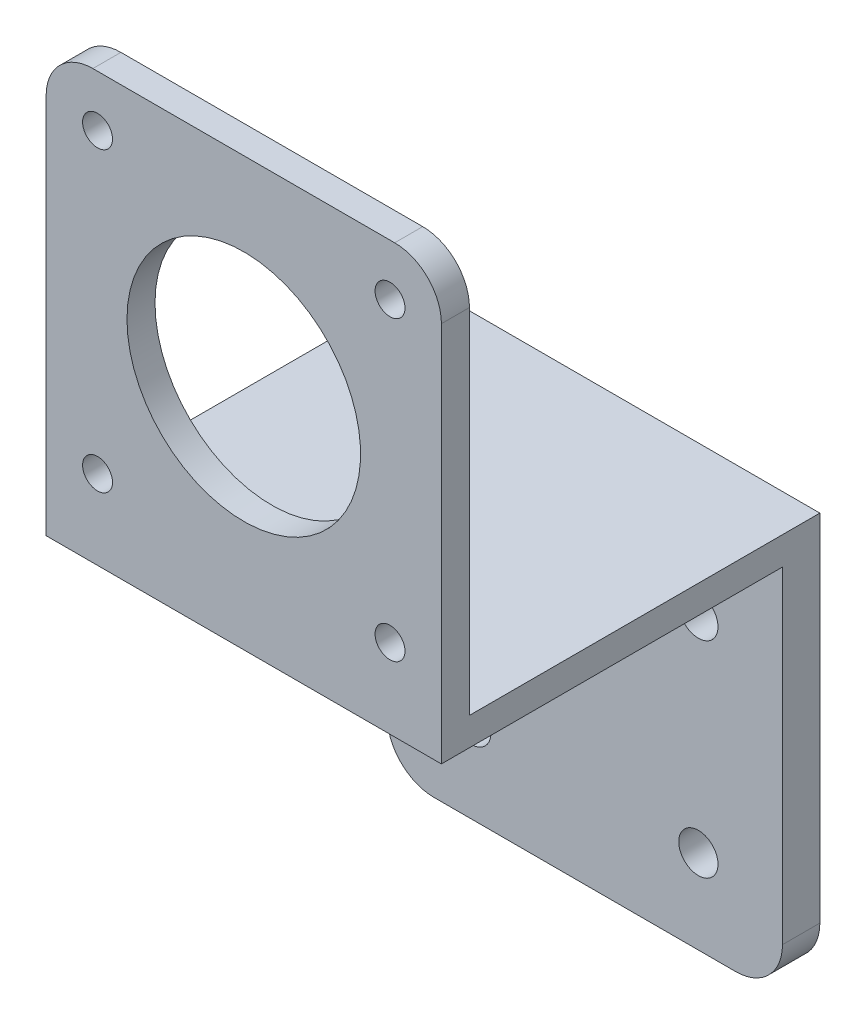
ISO-10303-21;
HEADER;
FILE_DESCRIPTION(('STEP AP214'),'2;1');
FILE_NAME('part.step','',(''),(''),'','','');
FILE_SCHEMA(('AUTOMOTIVE_DESIGN { 1 0 10303 214 1 1 1 1 }'));
ENDSEC;
DATA;
#1=APPLICATION_CONTEXT('core data for automotive mechanical design processes');
#2=APPLICATION_PROTOCOL_DEFINITION('international standard','automotive_design',2000,#1);
#3=PRODUCT_CONTEXT('',#1,'mechanical');
#4=PRODUCT('Part','Part','',(#3));
#5=PRODUCT_RELATED_PRODUCT_CATEGORY('part','',(#4));
#6=PRODUCT_DEFINITION_FORMATION('','',#4);
#7=PRODUCT_DEFINITION_CONTEXT('part definition',#1,'design');
#8=PRODUCT_DEFINITION('design','',#6,#7);
#9=PRODUCT_DEFINITION_SHAPE('','',#8);
#10=(LENGTH_UNIT() NAMED_UNIT(*) SI_UNIT(.MILLI.,.METRE.));
#11=(NAMED_UNIT(*) PLANE_ANGLE_UNIT() SI_UNIT($,.RADIAN.));
#12=(NAMED_UNIT(*) SI_UNIT($,.STERADIAN.) SOLID_ANGLE_UNIT());
#13=UNCERTAINTY_MEASURE_WITH_UNIT(LENGTH_MEASURE(1.E-05),#10,'distance_accuracy_value','');
#14=(GEOMETRIC_REPRESENTATION_CONTEXT(3) GLOBAL_UNCERTAINTY_ASSIGNED_CONTEXT((#13)) GLOBAL_UNIT_ASSIGNED_CONTEXT((#10,
#11,#12)) REPRESENTATION_CONTEXT('',''));
#15=CARTESIAN_POINT('',(0.,0.,0.));
#16=DIRECTION('',(0.,0.,1.));
#17=DIRECTION('',(1.,0.,0.));
#18=AXIS2_PLACEMENT_3D('',#15,#16,#17);
#19=CARTESIAN_POINT('',(21.15,21.4,3.));
#20=DIRECTION('',(-1.,0.,0.));
#21=DIRECTION('',(0.,-1.,0.));
#22=AXIS2_PLACEMENT_3D('',#19,#20,#21);
#23=PLANE('',#22);
#24=DIRECTION('',(0.,1.,0.));
#25=VECTOR('',#24,1.);
#26=CARTESIAN_POINT('',(21.15,21.4,0.));
#27=LINE('',#26,#25);
#28=CARTESIAN_POINT('',(21.15,-21.4,0.));
#29=VERTEX_POINT('',#28);
#30=CARTESIAN_POINT('',(21.15,16.4,0.));
#31=VERTEX_POINT('',#30);
#32=EDGE_CURVE('E236',#29,#31,#27,.T.);
#33=ORIENTED_EDGE('',*,*,#32,.T.);
#34=DIRECTION('',(0.,0.,-1.));
#35=VECTOR('',#34,1.);
#36=CARTESIAN_POINT('',(21.15,16.4,3.));
#37=LINE('',#36,#35);
#38=CARTESIAN_POINT('',(21.15,16.4,3.));
#39=VERTEX_POINT('',#38);
#40=EDGE_CURVE('E293',#31,#39,#37,.F.);
#41=ORIENTED_EDGE('',*,*,#40,.T.);
#42=DIRECTION('',(0.,1.,0.));
#43=VECTOR('',#42,1.);
#44=CARTESIAN_POINT('',(21.15,21.4,3.));
#45=LINE('',#44,#43);
#46=CARTESIAN_POINT('',(21.15,-24.4,3.));
#47=VERTEX_POINT('',#46);
#48=EDGE_CURVE('E240',#47,#39,#45,.T.);
#49=ORIENTED_EDGE('',*,*,#48,.F.);
#50=DIRECTION('',(0.,0.,1.));
#51=VECTOR('',#50,1.);
#52=CARTESIAN_POINT('',(21.15,-24.4,3.));
#53=LINE('',#52,#51);
#54=CARTESIAN_POINT('',(21.15,-24.4,-33.5));
#55=VERTEX_POINT('',#54);
#56=EDGE_CURVE('E158',#55,#47,#53,.T.);
#57=ORIENTED_EDGE('',*,*,#56,.F.);
#58=DIRECTION('',(0.,1.,0.));
#59=VECTOR('',#58,1.);
#60=CARTESIAN_POINT('',(21.15,-64.4,-33.5));
#61=LINE('',#60,#59);
#62=CARTESIAN_POINT('',(21.15,-59.4,-33.5));
#63=VERTEX_POINT('',#62);
#64=EDGE_CURVE('E146',#63,#55,#61,.T.);
#65=ORIENTED_EDGE('',*,*,#64,.F.);
#66=DIRECTION('',(0.,0.,1.));
#67=VECTOR('',#66,1.);
#68=CARTESIAN_POINT('',(21.15,-59.4,3.));
#69=LINE('',#68,#67);
#70=CARTESIAN_POINT('',(21.15,-59.4,-37.5));
#71=VERTEX_POINT('',#70);
#72=EDGE_CURVE('E290',#63,#71,#69,.F.);
#73=ORIENTED_EDGE('',*,*,#72,.T.);
#74=DIRECTION('',(0.,1.,0.));
#75=VECTOR('',#74,1.);
#76=CARTESIAN_POINT('',(21.15,-24.4,-37.5));
#77=LINE('',#76,#75);
#78=CARTESIAN_POINT('',(21.15,-21.4,-37.5));
#79=VERTEX_POINT('',#78);
#80=EDGE_CURVE('E183',#71,#79,#77,.T.);
#81=ORIENTED_EDGE('',*,*,#80,.T.);
#82=DIRECTION('',(0.,0.,1.));
#83=VECTOR('',#82,1.);
#84=CARTESIAN_POINT('',(21.15,-21.4,3.));
#85=LINE('',#84,#83);
#86=EDGE_CURVE('E159',#79,#29,#85,.T.);
#87=ORIENTED_EDGE('',*,*,#86,.T.);
#88=EDGE_LOOP('',(#33,#41,#49,#57,#65,#73,#81,#87));
#89=FACE_BOUND('',#88,.T.);
#90=ADVANCED_FACE('F45',(#89),#23,.F.);
#91=CARTESIAN_POINT('',(-21.15,21.4,3.));
#92=DIRECTION('',(0.,-1.,0.));
#93=DIRECTION('',(0.,0.,-1.));
#94=AXIS2_PLACEMENT_3D('',#91,#92,#93);
#95=PLANE('',#94);
#96=DIRECTION('',(-1.,0.,0.));
#97=VECTOR('',#96,1.);
#98=CARTESIAN_POINT('',(-21.15,21.4,0.));
#99=LINE('',#98,#97);
#100=CARTESIAN_POINT('',(16.15,21.4,0.));
#101=VERTEX_POINT('',#100);
#102=CARTESIAN_POINT('',(-16.15,21.4,0.));
#103=VERTEX_POINT('',#102);
#104=EDGE_CURVE('E255',#101,#103,#99,.T.);
#105=ORIENTED_EDGE('',*,*,#104,.T.);
#106=DIRECTION('',(0.,0.,-1.));
#107=VECTOR('',#106,1.);
#108=CARTESIAN_POINT('',(-16.15,21.4,3.));
#109=LINE('',#108,#107);
#110=CARTESIAN_POINT('',(-16.15,21.4,3.));
#111=VERTEX_POINT('',#110);
#112=EDGE_CURVE('E281',#103,#111,#109,.F.);
#113=ORIENTED_EDGE('',*,*,#112,.T.);
#114=DIRECTION('',(-1.,0.,0.));
#115=VECTOR('',#114,1.);
#116=CARTESIAN_POINT('',(-21.15,21.4,3.));
#117=LINE('',#116,#115);
#118=CARTESIAN_POINT('',(16.15,21.4,3.));
#119=VERTEX_POINT('',#118);
#120=EDGE_CURVE('E244',#119,#111,#117,.T.);
#121=ORIENTED_EDGE('',*,*,#120,.F.);
#122=DIRECTION('',(0.,0.,-1.));
#123=VECTOR('',#122,1.);
#124=CARTESIAN_POINT('',(16.15,21.4,3.));
#125=LINE('',#124,#123);
#126=EDGE_CURVE('E277',#119,#101,#125,.T.);
#127=ORIENTED_EDGE('',*,*,#126,.T.);
#128=EDGE_LOOP('',(#105,#113,#121,#127));
#129=FACE_BOUND('',#128,.T.);
#130=ADVANCED_FACE('F337',(#129),#95,.F.);
#131=CARTESIAN_POINT('',(-21.15,21.4,3.));
#132=DIRECTION('',(1.,0.,0.));
#133=DIRECTION('',(0.,1.,0.));
#134=AXIS2_PLACEMENT_3D('',#131,#132,#133);
#135=PLANE('',#134);
#136=DIRECTION('',(0.,-1.,0.));
#137=VECTOR('',#136,1.);
#138=CARTESIAN_POINT('',(-21.15,21.4,3.));
#139=LINE('',#138,#137);
#140=CARTESIAN_POINT('',(-21.15,16.4,3.));
#141=VERTEX_POINT('',#140);
#142=CARTESIAN_POINT('',(-21.15,-24.4,3.));
#143=VERTEX_POINT('',#142);
#144=EDGE_CURVE('E249',#141,#143,#139,.T.);
#145=ORIENTED_EDGE('',*,*,#144,.F.);
#146=DIRECTION('',(0.,0.,-1.));
#147=VECTOR('',#146,1.);
#148=CARTESIAN_POINT('',(-21.15,16.4,3.));
#149=LINE('',#148,#147);
#150=CARTESIAN_POINT('',(-21.15,16.4,0.));
#151=VERTEX_POINT('',#150);
#152=EDGE_CURVE('E267',#141,#151,#149,.T.);
#153=ORIENTED_EDGE('',*,*,#152,.T.);
#154=DIRECTION('',(0.,-1.,0.));
#155=VECTOR('',#154,1.);
#156=CARTESIAN_POINT('',(-21.15,21.4,0.));
#157=LINE('',#156,#155);
#158=CARTESIAN_POINT('',(-21.15,-21.4,0.));
#159=VERTEX_POINT('',#158);
#160=EDGE_CURVE('E259',#151,#159,#157,.T.);
#161=ORIENTED_EDGE('',*,*,#160,.T.);
#162=DIRECTION('',(0.,0.,-1.));
#163=VECTOR('',#162,1.);
#164=CARTESIAN_POINT('',(-21.15,-21.4,3.));
#165=LINE('',#164,#163);
#166=CARTESIAN_POINT('',(-21.15,-21.4,-37.5));
#167=VERTEX_POINT('',#166);
#168=EDGE_CURVE('E177',#159,#167,#165,.T.);
#169=ORIENTED_EDGE('',*,*,#168,.T.);
#170=DIRECTION('',(0.,1.,0.));
#171=VECTOR('',#170,1.);
#172=CARTESIAN_POINT('',(-21.15,-24.4,-37.5));
#173=LINE('',#172,#171);
#174=CARTESIAN_POINT('',(-21.15,-59.4,-37.5));
#175=VERTEX_POINT('',#174);
#176=EDGE_CURVE('E196',#175,#167,#173,.T.);
#177=ORIENTED_EDGE('',*,*,#176,.F.);
#178=DIRECTION('',(0.,0.,-1.));
#179=VECTOR('',#178,1.);
#180=CARTESIAN_POINT('',(-21.15,-59.4,3.));
#181=LINE('',#180,#179);
#182=CARTESIAN_POINT('',(-21.15,-59.4,-33.5));
#183=VERTEX_POINT('',#182);
#184=EDGE_CURVE('E143',#175,#183,#181,.F.);
#185=ORIENTED_EDGE('',*,*,#184,.T.);
#186=DIRECTION('',(0.,1.,0.));
#187=VECTOR('',#186,1.);
#188=CARTESIAN_POINT('',(-21.15,-64.4,-33.5));
#189=LINE('',#188,#187);
#190=CARTESIAN_POINT('',(-21.15,-24.4,-33.5));
#191=VERTEX_POINT('',#190);
#192=EDGE_CURVE('E136',#183,#191,#189,.T.);
#193=ORIENTED_EDGE('',*,*,#192,.T.);
#194=DIRECTION('',(0.,0.,-1.));
#195=VECTOR('',#194,1.);
#196=CARTESIAN_POINT('',(-21.15,-24.4,3.));
#197=LINE('',#196,#195);
#198=EDGE_CURVE('E140',#143,#191,#197,.T.);
#199=ORIENTED_EDGE('',*,*,#198,.F.);
#200=EDGE_LOOP('',(#145,#153,#161,#169,#177,#185,#193,#199));
#201=FACE_BOUND('',#200,.T.);
#202=ADVANCED_FACE('F139',(#201),#135,.F.);
#203=CARTESIAN_POINT('',(0.,0.,3.));
#204=DIRECTION('',(0.,0.,1.));
#205=DIRECTION('',(1.,0.,0.));
#206=AXIS2_PLACEMENT_3D('',#203,#204,#205);
#207=PLANE('',#206);
#208=CARTESIAN_POINT('',(-15.65,-15.9,3.));
#209=DIRECTION('',(0.,0.,-1.));
#210=DIRECTION('',(-1.,0.,0.));
#211=AXIS2_PLACEMENT_3D('',#208,#209,#210);
#212=CIRCLE('',#211,1.6);
#213=CARTESIAN_POINT('',(-17.25,-15.9,3.));
#214=VERTEX_POINT('',#213);
#215=EDGE_CURVE('E199',#214,#214,#212,.T.);
#216=ORIENTED_EDGE('',*,*,#215,.T.);
#217=EDGE_LOOP('',(#216));
#218=FACE_BOUND('',#217,.T.);
#219=CARTESIAN_POINT('',(15.65,-15.9,3.));
#220=DIRECTION('',(0.,0.,-1.));
#221=DIRECTION('',(-1.,0.,0.));
#222=AXIS2_PLACEMENT_3D('',#219,#220,#221);
#223=CIRCLE('',#222,1.6);
#224=CARTESIAN_POINT('',(14.05,-15.9,3.));
#225=VERTEX_POINT('',#224);
#226=EDGE_CURVE('E221',#225,#225,#223,.T.);
#227=ORIENTED_EDGE('',*,*,#226,.T.);
#228=EDGE_LOOP('',(#227));
#229=FACE_BOUND('',#228,.T.);
#230=CARTESIAN_POINT('',(-15.65,15.9,3.));
#231=DIRECTION('',(0.,0.,-1.));
#232=DIRECTION('',(-1.,0.,0.));
#233=AXIS2_PLACEMENT_3D('',#230,#231,#232);
#234=CIRCLE('',#233,1.6);
#235=CARTESIAN_POINT('',(-17.25,15.9,3.));
#236=VERTEX_POINT('',#235);
#237=EDGE_CURVE('E213',#236,#236,#234,.T.);
#238=ORIENTED_EDGE('',*,*,#237,.T.);
#239=EDGE_LOOP('',(#238));
#240=FACE_BOUND('',#239,.T.);
#241=CARTESIAN_POINT('',(15.65,15.9,3.));
#242=DIRECTION('',(0.,0.,-1.));
#243=DIRECTION('',(-1.,0.,0.));
#244=AXIS2_PLACEMENT_3D('',#241,#242,#243);
#245=CIRCLE('',#244,1.6);
#246=CARTESIAN_POINT('',(14.05,15.9,3.));
#247=VERTEX_POINT('',#246);
#248=EDGE_CURVE('E205',#247,#247,#245,.T.);
#249=ORIENTED_EDGE('',*,*,#248,.T.);
#250=EDGE_LOOP('',(#249));
#251=FACE_BOUND('',#250,.T.);
#252=CARTESIAN_POINT('',(0.,0.,3.));
#253=DIRECTION('',(0.,0.,-1.));
#254=DIRECTION('',(-1.,0.,0.));
#255=AXIS2_PLACEMENT_3D('',#252,#253,#254);
#256=CIRCLE('',#255,12.5);
#257=CARTESIAN_POINT('',(-12.5,0.,3.));
#258=VERTEX_POINT('',#257);
#259=EDGE_CURVE('E232',#258,#258,#256,.T.);
#260=ORIENTED_EDGE('',*,*,#259,.T.);
#261=EDGE_LOOP('',(#260));
#262=FACE_BOUND('',#261,.T.);
#263=ORIENTED_EDGE('',*,*,#120,.T.);
#264=CARTESIAN_POINT('',(-16.15,16.4,3.));
#265=DIRECTION('',(0.,0.,1.));
#266=DIRECTION('',(1.,0.,0.));
#267=AXIS2_PLACEMENT_3D('',#264,#265,#266);
#268=CIRCLE('',#267,5.);
#269=EDGE_CURVE('E287',#111,#141,#268,.T.);
#270=ORIENTED_EDGE('',*,*,#269,.T.);
#271=ORIENTED_EDGE('',*,*,#144,.T.);
#272=DIRECTION('',(-1.,0.,0.));
#273=VECTOR('',#272,1.);
#274=CARTESIAN_POINT('',(-21.15,-24.4,3.));
#275=LINE('',#274,#273);
#276=EDGE_CURVE('E156',#47,#143,#275,.T.);
#277=ORIENTED_EDGE('',*,*,#276,.F.);
#278=ORIENTED_EDGE('',*,*,#48,.T.);
#279=CARTESIAN_POINT('',(16.15,16.4,3.));
#280=DIRECTION('',(0.,0.,1.));
#281=DIRECTION('',(1.,0.,0.));
#282=AXIS2_PLACEMENT_3D('',#279,#280,#281);
#283=CIRCLE('',#282,5.);
#284=EDGE_CURVE('E284',#39,#119,#283,.T.);
#285=ORIENTED_EDGE('',*,*,#284,.T.);
#286=EDGE_LOOP('',(#263,#270,#271,#277,#278,#285));
#287=FACE_BOUND('',#286,.T.);
#288=ADVANCED_FACE('F341',(#218,#229,#240,#251,#262,#287),#207,.T.);
#289=CARTESIAN_POINT('',(0.,0.,0.));
#290=DIRECTION('',(0.,0.,1.));
#291=DIRECTION('',(1.,0.,0.));
#292=AXIS2_PLACEMENT_3D('',#289,#290,#291);
#293=PLANE('',#292);
#294=CARTESIAN_POINT('',(-15.65,-15.9,0.));
#295=DIRECTION('',(0.,0.,-1.));
#296=DIRECTION('',(-1.,0.,0.));
#297=AXIS2_PLACEMENT_3D('',#294,#295,#296);
#298=CIRCLE('',#297,1.6);
#299=CARTESIAN_POINT('',(-17.25,-15.9,0.));
#300=VERTEX_POINT('',#299);
#301=EDGE_CURVE('E225',#300,#300,#298,.T.);
#302=ORIENTED_EDGE('',*,*,#301,.F.);
#303=EDGE_LOOP('',(#302));
#304=FACE_BOUND('',#303,.T.);
#305=CARTESIAN_POINT('',(15.65,-15.9,0.));
#306=DIRECTION('',(0.,0.,-1.));
#307=DIRECTION('',(-1.,0.,0.));
#308=AXIS2_PLACEMENT_3D('',#305,#306,#307);
#309=CIRCLE('',#308,1.6);
#310=CARTESIAN_POINT('',(14.05,-15.9,0.));
#311=VERTEX_POINT('',#310);
#312=EDGE_CURVE('E217',#311,#311,#309,.T.);
#313=ORIENTED_EDGE('',*,*,#312,.F.);
#314=EDGE_LOOP('',(#313));
#315=FACE_BOUND('',#314,.T.);
#316=CARTESIAN_POINT('',(-15.65,15.9,0.));
#317=DIRECTION('',(0.,0.,-1.));
#318=DIRECTION('',(-1.,0.,0.));
#319=AXIS2_PLACEMENT_3D('',#316,#317,#318);
#320=CIRCLE('',#319,1.6);
#321=CARTESIAN_POINT('',(-17.25,15.9,0.));
#322=VERTEX_POINT('',#321);
#323=EDGE_CURVE('E209',#322,#322,#320,.T.);
#324=ORIENTED_EDGE('',*,*,#323,.F.);
#325=EDGE_LOOP('',(#324));
#326=FACE_BOUND('',#325,.T.);
#327=CARTESIAN_POINT('',(15.65,15.9,0.));
#328=DIRECTION('',(0.,0.,-1.));
#329=DIRECTION('',(-1.,0.,0.));
#330=AXIS2_PLACEMENT_3D('',#327,#328,#329);
#331=CIRCLE('',#330,1.6);
#332=CARTESIAN_POINT('',(14.05,15.9,0.));
#333=VERTEX_POINT('',#332);
#334=EDGE_CURVE('E200',#333,#333,#331,.T.);
#335=ORIENTED_EDGE('',*,*,#334,.F.);
#336=EDGE_LOOP('',(#335));
#337=FACE_BOUND('',#336,.T.);
#338=CARTESIAN_POINT('',(0.,0.,0.));
#339=DIRECTION('',(0.,0.,-1.));
#340=DIRECTION('',(-1.,0.,0.));
#341=AXIS2_PLACEMENT_3D('',#338,#339,#340);
#342=CIRCLE('',#341,12.5);
#343=CARTESIAN_POINT('',(-12.5,0.,0.));
#344=VERTEX_POINT('',#343);
#345=EDGE_CURVE('E204',#344,#344,#342,.T.);
#346=ORIENTED_EDGE('',*,*,#345,.F.);
#347=EDGE_LOOP('',(#346));
#348=FACE_BOUND('',#347,.T.);
#349=ORIENTED_EDGE('',*,*,#160,.F.);
#350=CARTESIAN_POINT('',(-16.15,16.4,0.));
#351=DIRECTION('',(0.,0.,1.));
#352=DIRECTION('',(1.,0.,0.));
#353=AXIS2_PLACEMENT_3D('',#350,#351,#352);
#354=CIRCLE('',#353,5.);
#355=EDGE_CURVE('E274',#151,#103,#354,.F.);
#356=ORIENTED_EDGE('',*,*,#355,.T.);
#357=ORIENTED_EDGE('',*,*,#104,.F.);
#358=CARTESIAN_POINT('',(16.15,16.4,0.));
#359=DIRECTION('',(0.,0.,1.));
#360=DIRECTION('',(1.,0.,0.));
#361=AXIS2_PLACEMENT_3D('',#358,#359,#360);
#362=CIRCLE('',#361,5.);
#363=EDGE_CURVE('E271',#101,#31,#362,.F.);
#364=ORIENTED_EDGE('',*,*,#363,.T.);
#365=ORIENTED_EDGE('',*,*,#32,.F.);
#366=DIRECTION('',(1.,0.,0.));
#367=VECTOR('',#366,1.);
#368=CARTESIAN_POINT('',(-21.15,-21.4,0.));
#369=LINE('',#368,#367);
#370=EDGE_CURVE('E245',#159,#29,#369,.T.);
#371=ORIENTED_EDGE('',*,*,#370,.F.);
#372=EDGE_LOOP('',(#349,#356,#357,#364,#365,#371));
#373=FACE_BOUND('',#372,.T.);
#374=ADVANCED_FACE('F329',(#304,#315,#326,#337,#348,#373),#293,.F.);
#375=CARTESIAN_POINT('',(0.,0.,3.));
#376=DIRECTION('',(0.,0.,-1.));
#377=DIRECTION('',(-1.,0.,0.));
#378=AXIS2_PLACEMENT_3D('',#375,#376,#377);
#379=CYLINDRICAL_SURFACE('',#378,12.5);
#380=ORIENTED_EDGE('',*,*,#259,.F.);
#381=EDGE_LOOP('',(#380));
#382=FACE_BOUND('',#381,.T.);
#383=ORIENTED_EDGE('',*,*,#345,.T.);
#384=EDGE_LOOP('',(#383));
#385=FACE_BOUND('',#384,.T.);
#386=ADVANCED_FACE('F368',(#382,#385),#379,.F.);
#387=CARTESIAN_POINT('',(15.65,15.9,3.));
#388=DIRECTION('',(0.,0.,-1.));
#389=DIRECTION('',(-1.,0.,0.));
#390=AXIS2_PLACEMENT_3D('',#387,#388,#389);
#391=CYLINDRICAL_SURFACE('',#390,1.6);
#392=ORIENTED_EDGE('',*,*,#248,.F.);
#393=EDGE_LOOP('',(#392));
#394=FACE_BOUND('',#393,.T.);
#395=ORIENTED_EDGE('',*,*,#334,.T.);
#396=EDGE_LOOP('',(#395));
#397=FACE_BOUND('',#396,.T.);
#398=ADVANCED_FACE('F375',(#394,#397),#391,.F.);
#399=CARTESIAN_POINT('',(-15.65,15.9,3.));
#400=DIRECTION('',(0.,0.,-1.));
#401=DIRECTION('',(-1.,0.,0.));
#402=AXIS2_PLACEMENT_3D('',#399,#400,#401);
#403=CYLINDRICAL_SURFACE('',#402,1.6);
#404=ORIENTED_EDGE('',*,*,#237,.F.);
#405=EDGE_LOOP('',(#404));
#406=FACE_BOUND('',#405,.T.);
#407=ORIENTED_EDGE('',*,*,#323,.T.);
#408=EDGE_LOOP('',(#407));
#409=FACE_BOUND('',#408,.T.);
#410=ADVANCED_FACE('F384',(#406,#409),#403,.F.);
#411=CARTESIAN_POINT('',(15.65,-15.9,3.));
#412=DIRECTION('',(0.,0.,-1.));
#413=DIRECTION('',(-1.,0.,0.));
#414=AXIS2_PLACEMENT_3D('',#411,#412,#413);
#415=CYLINDRICAL_SURFACE('',#414,1.6);
#416=ORIENTED_EDGE('',*,*,#226,.F.);
#417=EDGE_LOOP('',(#416));
#418=FACE_BOUND('',#417,.T.);
#419=ORIENTED_EDGE('',*,*,#312,.T.);
#420=EDGE_LOOP('',(#419));
#421=FACE_BOUND('',#420,.T.);
#422=ADVANCED_FACE('F380',(#418,#421),#415,.F.);
#423=CARTESIAN_POINT('',(-15.65,-15.9,3.));
#424=DIRECTION('',(0.,0.,-1.));
#425=DIRECTION('',(-1.,0.,0.));
#426=AXIS2_PLACEMENT_3D('',#423,#424,#425);
#427=CYLINDRICAL_SURFACE('',#426,1.6);
#428=ORIENTED_EDGE('',*,*,#215,.F.);
#429=EDGE_LOOP('',(#428));
#430=FACE_BOUND('',#429,.T.);
#431=ORIENTED_EDGE('',*,*,#301,.T.);
#432=EDGE_LOOP('',(#431));
#433=FACE_BOUND('',#432,.T.);
#434=ADVANCED_FACE('F377',(#430,#433),#427,.F.);
#435=CARTESIAN_POINT('',(0.,-21.4,0.));
#436=DIRECTION('',(0.,-1.,0.));
#437=DIRECTION('',(0.,0.,-1.));
#438=AXIS2_PLACEMENT_3D('',#435,#436,#437);
#439=PLANE('',#438);
#440=ORIENTED_EDGE('',*,*,#168,.F.);
#441=ORIENTED_EDGE('',*,*,#370,.T.);
#442=ORIENTED_EDGE('',*,*,#86,.F.);
#443=DIRECTION('',(1.,0.,0.));
#444=VECTOR('',#443,1.);
#445=CARTESIAN_POINT('',(-21.15,-21.4,-37.5));
#446=LINE('',#445,#444);
#447=EDGE_CURVE('E187',#167,#79,#446,.T.);
#448=ORIENTED_EDGE('',*,*,#447,.F.);
#449=EDGE_LOOP('',(#440,#441,#442,#448));
#450=FACE_BOUND('',#449,.T.);
#451=ADVANCED_FACE('F325',(#450),#439,.F.);
#452=CARTESIAN_POINT('',(-21.15,-24.4,-37.5));
#453=DIRECTION('',(0.,0.,1.));
#454=DIRECTION('',(1.,0.,0.));
#455=AXIS2_PLACEMENT_3D('',#452,#453,#454);
#456=PLANE('',#455);
#457=CARTESIAN_POINT('',(12.15,-33.4,-37.5));
#458=DIRECTION('',(0.,0.,1.));
#459=DIRECTION('',(1.,0.,0.));
#460=AXIS2_PLACEMENT_3D('',#457,#458,#459);
#461=CIRCLE('',#460,2.1);
#462=CARTESIAN_POINT('',(14.25,-33.4,-37.5));
#463=VERTEX_POINT('',#462);
#464=EDGE_CURVE('E437',#463,#463,#461,.T.);
#465=ORIENTED_EDGE('',*,*,#464,.T.);
#466=EDGE_LOOP('',(#465));
#467=FACE_BOUND('',#466,.T.);
#468=CARTESIAN_POINT('',(-12.15,-55.4,-37.5));
#469=DIRECTION('',(0.,0.,1.));
#470=DIRECTION('',(1.,0.,0.));
#471=AXIS2_PLACEMENT_3D('',#468,#469,#470);
#472=CIRCLE('',#471,2.1);
#473=CARTESIAN_POINT('',(-10.05,-55.4,-37.5));
#474=VERTEX_POINT('',#473);
#475=EDGE_CURVE('E424',#474,#474,#472,.T.);
#476=ORIENTED_EDGE('',*,*,#475,.T.);
#477=EDGE_LOOP('',(#476));
#478=FACE_BOUND('',#477,.T.);
#479=CARTESIAN_POINT('',(12.15,-55.4,-37.5));
#480=DIRECTION('',(0.,0.,1.));
#481=DIRECTION('',(1.,0.,0.));
#482=AXIS2_PLACEMENT_3D('',#479,#480,#481);
#483=CIRCLE('',#482,2.1);
#484=CARTESIAN_POINT('',(14.25,-55.4,-37.5));
#485=VERTEX_POINT('',#484);
#486=EDGE_CURVE('E418',#485,#485,#483,.T.);
#487=ORIENTED_EDGE('',*,*,#486,.T.);
#488=EDGE_LOOP('',(#487));
#489=FACE_BOUND('',#488,.T.);
#490=CARTESIAN_POINT('',(-12.15,-33.4,-37.5));
#491=DIRECTION('',(0.,0.,1.));
#492=DIRECTION('',(1.,0.,0.));
#493=AXIS2_PLACEMENT_3D('',#490,#491,#492);
#494=CIRCLE('',#493,2.1);
#495=CARTESIAN_POINT('',(-10.05,-33.4,-37.5));
#496=VERTEX_POINT('',#495);
#497=EDGE_CURVE('E165',#496,#496,#494,.T.);
#498=ORIENTED_EDGE('',*,*,#497,.T.);
#499=EDGE_LOOP('',(#498));
#500=FACE_BOUND('',#499,.T.);
#501=ORIENTED_EDGE('',*,*,#80,.F.);
#502=CARTESIAN_POINT('',(16.15,-59.4,-37.5));
#503=DIRECTION('',(0.,0.,1.));
#504=DIRECTION('',(1.,0.,0.));
#505=AXIS2_PLACEMENT_3D('',#502,#503,#504);
#506=CIRCLE('',#505,5.);
#507=CARTESIAN_POINT('',(16.15,-64.4,-37.5));
#508=VERTEX_POINT('',#507);
#509=EDGE_CURVE('E11',#71,#508,#506,.F.);
#510=ORIENTED_EDGE('',*,*,#509,.T.);
#511=DIRECTION('',(1.,0.,0.));
#512=VECTOR('',#511,1.);
#513=CARTESIAN_POINT('',(-21.15,-64.4,-37.5));
#514=LINE('',#513,#512);
#515=CARTESIAN_POINT('',(-16.15,-64.4,-37.5));
#516=VERTEX_POINT('',#515);
#517=EDGE_CURVE('E164',#516,#508,#514,.T.);
#518=ORIENTED_EDGE('',*,*,#517,.F.);
#519=CARTESIAN_POINT('',(-16.15,-59.4,-37.5));
#520=DIRECTION('',(0.,0.,1.));
#521=DIRECTION('',(1.,0.,0.));
#522=AXIS2_PLACEMENT_3D('',#519,#520,#521);
#523=CIRCLE('',#522,5.);
#524=EDGE_CURVE('E54',#516,#175,#523,.F.);
#525=ORIENTED_EDGE('',*,*,#524,.T.);
#526=ORIENTED_EDGE('',*,*,#176,.T.);
#527=ORIENTED_EDGE('',*,*,#447,.T.);
#528=EDGE_LOOP('',(#501,#510,#518,#525,#526,#527));
#529=FACE_BOUND('',#528,.T.);
#530=ADVANCED_FACE('F310',(#467,#478,#489,#500,#529),#456,.F.);
#531=CARTESIAN_POINT('',(0.,-24.4,0.));
#532=DIRECTION('',(0.,-1.,0.));
#533=DIRECTION('',(0.,0.,-1.));
#534=AXIS2_PLACEMENT_3D('',#531,#532,#533);
#535=PLANE('',#534);
#536=DIRECTION('',(-1.,0.,0.));
#537=VECTOR('',#536,1.);
#538=CARTESIAN_POINT('',(-21.15,-24.4,-33.5));
#539=LINE('',#538,#537);
#540=EDGE_CURVE('E153',#55,#191,#539,.T.);
#541=ORIENTED_EDGE('',*,*,#540,.F.);
#542=ORIENTED_EDGE('',*,*,#56,.T.);
#543=ORIENTED_EDGE('',*,*,#276,.T.);
#544=ORIENTED_EDGE('',*,*,#198,.T.);
#545=EDGE_LOOP('',(#541,#542,#543,#544));
#546=FACE_BOUND('',#545,.T.);
#547=ADVANCED_FACE('F152',(#546),#535,.T.);
#548=CARTESIAN_POINT('',(-21.15,-64.4,-33.5));
#549=DIRECTION('',(0.,0.,-1.));
#550=DIRECTION('',(-1.,0.,0.));
#551=AXIS2_PLACEMENT_3D('',#548,#549,#550);
#552=PLANE('',#551);
#553=CARTESIAN_POINT('',(12.15,-33.4,-33.5));
#554=DIRECTION('',(0.,0.,1.));
#555=DIRECTION('',(1.,0.,0.));
#556=AXIS2_PLACEMENT_3D('',#553,#554,#555);
#557=CIRCLE('',#556,2.1);
#558=CARTESIAN_POINT('',(14.25,-33.4,-33.5));
#559=VERTEX_POINT('',#558);
#560=EDGE_CURVE('E433',#559,#559,#557,.T.);
#561=ORIENTED_EDGE('',*,*,#560,.F.);
#562=EDGE_LOOP('',(#561));
#563=FACE_BOUND('',#562,.T.);
#564=CARTESIAN_POINT('',(-12.15,-55.4,-33.5));
#565=DIRECTION('',(0.,0.,1.));
#566=DIRECTION('',(1.,0.,0.));
#567=AXIS2_PLACEMENT_3D('',#564,#565,#566);
#568=CIRCLE('',#567,2.1);
#569=CARTESIAN_POINT('',(-10.05,-55.4,-33.5));
#570=VERTEX_POINT('',#569);
#571=EDGE_CURVE('E429',#570,#570,#568,.T.);
#572=ORIENTED_EDGE('',*,*,#571,.F.);
#573=EDGE_LOOP('',(#572));
#574=FACE_BOUND('',#573,.T.);
#575=CARTESIAN_POINT('',(12.15,-55.4,-33.5));
#576=DIRECTION('',(0.,0.,1.));
#577=DIRECTION('',(1.,0.,0.));
#578=AXIS2_PLACEMENT_3D('',#575,#576,#577);
#579=CIRCLE('',#578,2.1);
#580=CARTESIAN_POINT('',(14.25,-55.4,-33.5));
#581=VERTEX_POINT('',#580);
#582=EDGE_CURVE('E421',#581,#581,#579,.T.);
#583=ORIENTED_EDGE('',*,*,#582,.F.);
#584=EDGE_LOOP('',(#583));
#585=FACE_BOUND('',#584,.T.);
#586=CARTESIAN_POINT('',(-12.15,-33.4,-33.5));
#587=DIRECTION('',(0.,0.,1.));
#588=DIRECTION('',(1.,0.,0.));
#589=AXIS2_PLACEMENT_3D('',#586,#587,#588);
#590=CIRCLE('',#589,2.1);
#591=CARTESIAN_POINT('',(-10.05,-33.4,-33.5));
#592=VERTEX_POINT('',#591);
#593=EDGE_CURVE('E172',#592,#592,#590,.T.);
#594=ORIENTED_EDGE('',*,*,#593,.F.);
#595=EDGE_LOOP('',(#594));
#596=FACE_BOUND('',#595,.T.);
#597=DIRECTION('',(-1.,0.,0.));
#598=VECTOR('',#597,1.);
#599=CARTESIAN_POINT('',(-21.15,-64.4,-33.5));
#600=LINE('',#599,#598);
#601=CARTESIAN_POINT('',(16.15,-64.4,-33.5));
#602=VERTEX_POINT('',#601);
#603=CARTESIAN_POINT('',(-16.15,-64.4,-33.5));
#604=VERTEX_POINT('',#603);
#605=EDGE_CURVE('E147',#602,#604,#600,.T.);
#606=ORIENTED_EDGE('',*,*,#605,.F.);
#607=CARTESIAN_POINT('',(16.15,-59.4,-33.5));
#608=DIRECTION('',(0.,0.,-1.));
#609=DIRECTION('',(-1.,0.,0.));
#610=AXIS2_PLACEMENT_3D('',#607,#608,#609);
#611=CIRCLE('',#610,5.);
#612=EDGE_CURVE('E69',#602,#63,#611,.F.);
#613=ORIENTED_EDGE('',*,*,#612,.T.);
#614=ORIENTED_EDGE('',*,*,#64,.T.);
#615=ORIENTED_EDGE('',*,*,#540,.T.);
#616=ORIENTED_EDGE('',*,*,#192,.F.);
#617=CARTESIAN_POINT('',(-16.15,-59.4,-33.5));
#618=DIRECTION('',(0.,0.,-1.));
#619=DIRECTION('',(-1.,0.,0.));
#620=AXIS2_PLACEMENT_3D('',#617,#618,#619);
#621=CIRCLE('',#620,5.);
#622=EDGE_CURVE('E61',#183,#604,#621,.F.);
#623=ORIENTED_EDGE('',*,*,#622,.T.);
#624=EDGE_LOOP('',(#606,#613,#614,#615,#616,#623));
#625=FACE_BOUND('',#624,.T.);
#626=ADVANCED_FACE('F161',(#563,#574,#585,#596,#625),#552,.F.);
#627=CARTESIAN_POINT('',(0.,-64.4,0.));
#628=DIRECTION('',(0.,1.,0.));
#629=DIRECTION('',(0.,0.,1.));
#630=AXIS2_PLACEMENT_3D('',#627,#628,#629);
#631=PLANE('',#630);
#632=ORIENTED_EDGE('',*,*,#517,.T.);
#633=DIRECTION('',(0.,0.,1.));
#634=VECTOR('',#633,1.);
#635=CARTESIAN_POINT('',(16.15,-64.4,0.));
#636=LINE('',#635,#634);
#637=EDGE_CURVE('E300',#508,#602,#636,.T.);
#638=ORIENTED_EDGE('',*,*,#637,.T.);
#639=ORIENTED_EDGE('',*,*,#605,.T.);
#640=DIRECTION('',(0.,0.,-1.));
#641=VECTOR('',#640,1.);
#642=CARTESIAN_POINT('',(-16.15,-64.4,0.));
#643=LINE('',#642,#641);
#644=EDGE_CURVE('E296',#604,#516,#643,.T.);
#645=ORIENTED_EDGE('',*,*,#644,.T.);
#646=EDGE_LOOP('',(#632,#638,#639,#645));
#647=FACE_BOUND('',#646,.T.);
#648=ADVANCED_FACE('F316',(#647),#631,.F.);
#649=CARTESIAN_POINT('',(-12.15,-33.4,-37.5));
#650=DIRECTION('',(0.,0.,1.));
#651=DIRECTION('',(1.,0.,0.));
#652=AXIS2_PLACEMENT_3D('',#649,#650,#651);
#653=CYLINDRICAL_SURFACE('',#652,2.1);
#654=ORIENTED_EDGE('',*,*,#497,.F.);
#655=EDGE_LOOP('',(#654));
#656=FACE_BOUND('',#655,.T.);
#657=ORIENTED_EDGE('',*,*,#593,.T.);
#658=EDGE_LOOP('',(#657));
#659=FACE_BOUND('',#658,.T.);
#660=ADVANCED_FACE('F403',(#656,#659),#653,.F.);
#661=CARTESIAN_POINT('',(12.15,-55.4,-37.5));
#662=DIRECTION('',(0.,0.,1.));
#663=DIRECTION('',(1.,0.,0.));
#664=AXIS2_PLACEMENT_3D('',#661,#662,#663);
#665=CYLINDRICAL_SURFACE('',#664,2.1);
#666=ORIENTED_EDGE('',*,*,#486,.F.);
#667=EDGE_LOOP('',(#666));
#668=FACE_BOUND('',#667,.T.);
#669=ORIENTED_EDGE('',*,*,#582,.T.);
#670=EDGE_LOOP('',(#669));
#671=FACE_BOUND('',#670,.T.);
#672=ADVANCED_FACE('F406',(#668,#671),#665,.F.);
#673=CARTESIAN_POINT('',(-12.15,-55.4,-37.5));
#674=DIRECTION('',(0.,0.,1.));
#675=DIRECTION('',(1.,0.,0.));
#676=AXIS2_PLACEMENT_3D('',#673,#674,#675);
#677=CYLINDRICAL_SURFACE('',#676,2.1);
#678=ORIENTED_EDGE('',*,*,#475,.F.);
#679=EDGE_LOOP('',(#678));
#680=FACE_BOUND('',#679,.T.);
#681=ORIENTED_EDGE('',*,*,#571,.T.);
#682=EDGE_LOOP('',(#681));
#683=FACE_BOUND('',#682,.T.);
#684=ADVANCED_FACE('F354',(#680,#683),#677,.F.);
#685=CARTESIAN_POINT('',(12.15,-33.4,-37.5));
#686=DIRECTION('',(0.,0.,1.));
#687=DIRECTION('',(1.,0.,0.));
#688=AXIS2_PLACEMENT_3D('',#685,#686,#687);
#689=CYLINDRICAL_SURFACE('',#688,2.1);
#690=ORIENTED_EDGE('',*,*,#464,.F.);
#691=EDGE_LOOP('',(#690));
#692=FACE_BOUND('',#691,.T.);
#693=ORIENTED_EDGE('',*,*,#560,.T.);
#694=EDGE_LOOP('',(#693));
#695=FACE_BOUND('',#694,.T.);
#696=ADVANCED_FACE('F346',(#692,#695),#689,.F.);
#697=CARTESIAN_POINT('',(-16.15,16.4,3.));
#698=DIRECTION('',(0.,0.,-1.));
#699=DIRECTION('',(-1.,0.,0.));
#700=AXIS2_PLACEMENT_3D('',#697,#698,#699);
#701=CYLINDRICAL_SURFACE('',#700,5.);
#702=ORIENTED_EDGE('',*,*,#269,.F.);
#703=ORIENTED_EDGE('',*,*,#112,.F.);
#704=ORIENTED_EDGE('',*,*,#355,.F.);
#705=ORIENTED_EDGE('',*,*,#152,.F.);
#706=EDGE_LOOP('',(#702,#703,#704,#705));
#707=FACE_BOUND('',#706,.T.);
#708=ADVANCED_FACE('F344',(#707),#701,.T.);
#709=CARTESIAN_POINT('',(16.15,16.4,3.));
#710=DIRECTION('',(0.,0.,-1.));
#711=DIRECTION('',(-1.,0.,0.));
#712=AXIS2_PLACEMENT_3D('',#709,#710,#711);
#713=CYLINDRICAL_SURFACE('',#712,5.);
#714=ORIENTED_EDGE('',*,*,#284,.F.);
#715=ORIENTED_EDGE('',*,*,#40,.F.);
#716=ORIENTED_EDGE('',*,*,#363,.F.);
#717=ORIENTED_EDGE('',*,*,#126,.F.);
#718=EDGE_LOOP('',(#714,#715,#716,#717));
#719=FACE_BOUND('',#718,.T.);
#720=ADVANCED_FACE('F334',(#719),#713,.T.);
#721=CARTESIAN_POINT('',(16.15,-59.4,0.));
#722=DIRECTION('',(0.,0.,1.));
#723=DIRECTION('',(1.,0.,0.));
#724=AXIS2_PLACEMENT_3D('',#721,#722,#723);
#725=CYLINDRICAL_SURFACE('',#724,5.);
#726=ORIENTED_EDGE('',*,*,#509,.F.);
#727=ORIENTED_EDGE('',*,*,#72,.F.);
#728=ORIENTED_EDGE('',*,*,#612,.F.);
#729=ORIENTED_EDGE('',*,*,#637,.F.);
#730=EDGE_LOOP('',(#726,#727,#728,#729));
#731=FACE_BOUND('',#730,.T.);
#732=ADVANCED_FACE('F321',(#731),#725,.T.);
#733=CARTESIAN_POINT('',(-16.15,-59.4,0.));
#734=DIRECTION('',(0.,0.,-1.));
#735=DIRECTION('',(-1.,0.,0.));
#736=AXIS2_PLACEMENT_3D('',#733,#734,#735);
#737=CYLINDRICAL_SURFACE('',#736,5.);
#738=ORIENTED_EDGE('',*,*,#622,.F.);
#739=ORIENTED_EDGE('',*,*,#184,.F.);
#740=ORIENTED_EDGE('',*,*,#524,.F.);
#741=ORIENTED_EDGE('',*,*,#644,.F.);
#742=EDGE_LOOP('',(#738,#739,#740,#741));
#743=FACE_BOUND('',#742,.T.);
#744=ADVANCED_FACE('F47',(#743),#737,.T.);
#745=CLOSED_SHELL('',(#90,#130,#202,#288,#374,#386,#398,#410,#422,#434,#451,#530,#547,#626,#648,
#660,#672,#684,#696,#708,#720,#732,#744));
#746=MANIFOLD_SOLID_BREP('B2',#745);
#747=ADVANCED_BREP_SHAPE_REPRESENTATION('',(#18,#746),#14);
#748=SHAPE_DEFINITION_REPRESENTATION(#9,#747);
ENDSEC;
END-ISO-10303-21;
